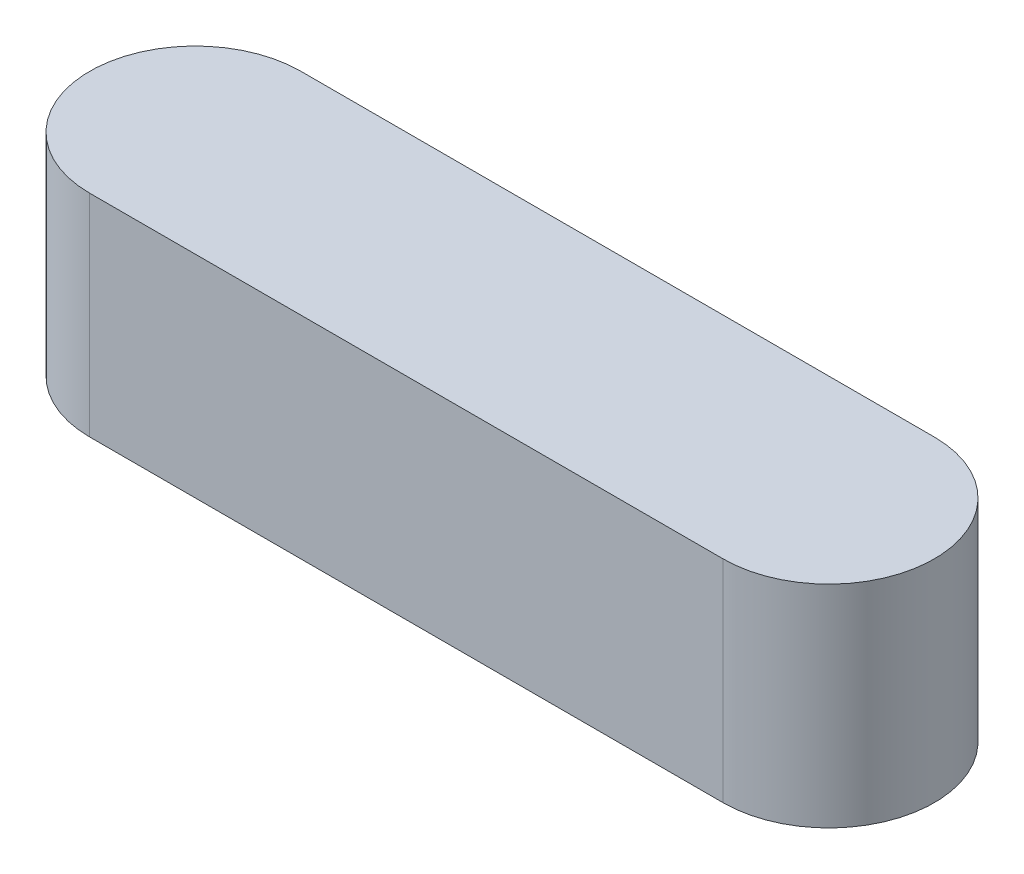
ISO-10303-21;
HEADER;
FILE_DESCRIPTION(('STEP AP214'),'2;1');
FILE_NAME('part.step','',(''),(''),'','','');
FILE_SCHEMA(('AUTOMOTIVE_DESIGN { 1 0 10303 214 1 1 1 1 }'));
ENDSEC;
DATA;
#1=APPLICATION_CONTEXT('core data for automotive mechanical design processes');
#2=APPLICATION_PROTOCOL_DEFINITION('international standard','automotive_design',2000,#1);
#3=PRODUCT_CONTEXT('',#1,'mechanical');
#4=PRODUCT('Part','Part','',(#3));
#5=PRODUCT_RELATED_PRODUCT_CATEGORY('part','',(#4));
#6=PRODUCT_DEFINITION_FORMATION('','',#4);
#7=PRODUCT_DEFINITION_CONTEXT('part definition',#1,'design');
#8=PRODUCT_DEFINITION('design','',#6,#7);
#9=PRODUCT_DEFINITION_SHAPE('','',#8);
#10=(LENGTH_UNIT() NAMED_UNIT(*) SI_UNIT(.MILLI.,.METRE.));
#11=(NAMED_UNIT(*) PLANE_ANGLE_UNIT() SI_UNIT($,.RADIAN.));
#12=(NAMED_UNIT(*) SI_UNIT($,.STERADIAN.) SOLID_ANGLE_UNIT());
#13=UNCERTAINTY_MEASURE_WITH_UNIT(LENGTH_MEASURE(1.E-05),#10,'distance_accuracy_value','');
#14=(GEOMETRIC_REPRESENTATION_CONTEXT(3) GLOBAL_UNCERTAINTY_ASSIGNED_CONTEXT((#13)) GLOBAL_UNIT_ASSIGNED_CONTEXT((#10,
#11,#12)) REPRESENTATION_CONTEXT('',''));
#15=CARTESIAN_POINT('',(0.,0.,0.));
#16=DIRECTION('',(0.,0.,1.));
#17=DIRECTION('',(1.,0.,0.));
#18=AXIS2_PLACEMENT_3D('',#15,#16,#17);
#19=CARTESIAN_POINT('',(1.5875,3.175,1.5875));
#20=DIRECTION('',(0.,-1.,0.));
#21=DIRECTION('',(0.,0.,-1.));
#22=AXIS2_PLACEMENT_3D('',#19,#20,#21);
#23=CYLINDRICAL_SURFACE('',#22,1.5875);
#24=DIRECTION('',(0.,-1.,0.));
#25=VECTOR('',#24,1.);
#26=CARTESIAN_POINT('',(1.5875,0.,3.175));
#27=LINE('',#26,#25);
#28=CARTESIAN_POINT('',(1.5875,3.175,3.175));
#29=VERTEX_POINT('',#28);
#30=CARTESIAN_POINT('',(1.5875,0.,3.175));
#31=VERTEX_POINT('',#30);
#32=EDGE_CURVE('E87',#29,#31,#27,.T.);
#33=ORIENTED_EDGE('',*,*,#32,.F.);
#34=CARTESIAN_POINT('',(1.5875,3.175,1.5875));
#35=DIRECTION('',(0.,-1.,0.));
#36=DIRECTION('',(0.,0.,-1.));
#37=AXIS2_PLACEMENT_3D('',#34,#35,#36);
#38=CIRCLE('',#37,1.5875);
#39=CARTESIAN_POINT('',(1.5875,3.175,0.));
#40=VERTEX_POINT('',#39);
#41=EDGE_CURVE('E50',#40,#29,#38,.F.);
#42=ORIENTED_EDGE('',*,*,#41,.F.);
#43=DIRECTION('',(0.,1.,0.));
#44=VECTOR('',#43,1.);
#45=CARTESIAN_POINT('',(1.5875,3.175,0.));
#46=LINE('',#45,#44);
#47=CARTESIAN_POINT('',(1.5875,0.,0.));
#48=VERTEX_POINT('',#47);
#49=EDGE_CURVE('E118',#48,#40,#46,.T.);
#50=ORIENTED_EDGE('',*,*,#49,.F.);
#51=CARTESIAN_POINT('',(1.5875,0.,1.5875));
#52=DIRECTION('',(0.,1.,0.));
#53=DIRECTION('',(0.,0.,1.));
#54=AXIS2_PLACEMENT_3D('',#51,#52,#53);
#55=CIRCLE('',#54,1.5875);
#56=EDGE_CURVE('E11',#31,#48,#55,.F.);
#57=ORIENTED_EDGE('',*,*,#56,.F.);
#58=EDGE_LOOP('',(#33,#42,#50,#57));
#59=FACE_BOUND('',#58,.T.);
#60=ADVANCED_FACE('F41',(#59),#23,.T.);
#61=CARTESIAN_POINT('',(11.1125,0.,1.5875));
#62=DIRECTION('',(0.,1.,0.));
#63=DIRECTION('',(0.,0.,1.));
#64=AXIS2_PLACEMENT_3D('',#61,#62,#63);
#65=CYLINDRICAL_SURFACE('',#64,1.5875);
#66=DIRECTION('',(0.,1.,0.));
#67=VECTOR('',#66,1.);
#68=CARTESIAN_POINT('',(11.1125,0.,3.175));
#69=LINE('',#68,#67);
#70=CARTESIAN_POINT('',(11.1125,0.,3.175));
#71=VERTEX_POINT('',#70);
#72=CARTESIAN_POINT('',(11.1125,3.175,3.175));
#73=VERTEX_POINT('',#72);
#74=EDGE_CURVE('E85',#71,#73,#69,.T.);
#75=ORIENTED_EDGE('',*,*,#74,.F.);
#76=CARTESIAN_POINT('',(11.1125,0.,1.5875));
#77=DIRECTION('',(0.,1.,0.));
#78=DIRECTION('',(0.,0.,1.));
#79=AXIS2_PLACEMENT_3D('',#76,#77,#78);
#80=CIRCLE('',#79,1.5875);
#81=CARTESIAN_POINT('',(11.1125,0.,0.));
#82=VERTEX_POINT('',#81);
#83=EDGE_CURVE('E93',#82,#71,#80,.F.);
#84=ORIENTED_EDGE('',*,*,#83,.F.);
#85=DIRECTION('',(0.,-1.,0.));
#86=VECTOR('',#85,1.);
#87=CARTESIAN_POINT('',(11.1125,0.,0.));
#88=LINE('',#87,#86);
#89=CARTESIAN_POINT('',(11.1125,3.175,0.));
#90=VERTEX_POINT('',#89);
#91=EDGE_CURVE('E102',#90,#82,#88,.T.);
#92=ORIENTED_EDGE('',*,*,#91,.F.);
#93=CARTESIAN_POINT('',(11.1125,3.175,1.5875));
#94=DIRECTION('',(0.,-1.,0.));
#95=DIRECTION('',(0.,0.,-1.));
#96=AXIS2_PLACEMENT_3D('',#93,#94,#95);
#97=CIRCLE('',#96,1.5875);
#98=EDGE_CURVE('E101',#73,#90,#97,.F.);
#99=ORIENTED_EDGE('',*,*,#98,.F.);
#100=EDGE_LOOP('',(#75,#84,#92,#99));
#101=FACE_BOUND('',#100,.T.);
#102=ADVANCED_FACE('F104',(#101),#65,.T.);
#103=CARTESIAN_POINT('',(0.,0.,3.175));
#104=DIRECTION('',(0.,1.,0.));
#105=DIRECTION('',(0.,0.,1.));
#106=AXIS2_PLACEMENT_3D('',#103,#104,#105);
#107=PLANE('',#106);
#108=DIRECTION('',(1.,0.,0.));
#109=VECTOR('',#108,1.);
#110=CARTESIAN_POINT('',(0.,0.,3.175));
#111=LINE('',#110,#109);
#112=EDGE_CURVE('E80',#31,#71,#111,.T.);
#113=ORIENTED_EDGE('',*,*,#112,.F.);
#114=ORIENTED_EDGE('',*,*,#56,.T.);
#115=DIRECTION('',(1.,0.,0.));
#116=VECTOR('',#115,1.);
#117=CARTESIAN_POINT('',(0.,0.,0.));
#118=LINE('',#117,#116);
#119=EDGE_CURVE('E96',#48,#82,#118,.T.);
#120=ORIENTED_EDGE('',*,*,#119,.T.);
#121=ORIENTED_EDGE('',*,*,#83,.T.);
#122=EDGE_LOOP('',(#113,#114,#120,#121));
#123=FACE_BOUND('',#122,.T.);
#124=ADVANCED_FACE('F94',(#123),#107,.F.);
#125=CARTESIAN_POINT('',(0.,3.175,3.175));
#126=DIRECTION('',(0.,-1.,0.));
#127=DIRECTION('',(0.,0.,-1.));
#128=AXIS2_PLACEMENT_3D('',#125,#126,#127);
#129=PLANE('',#128);
#130=DIRECTION('',(-1.,0.,0.));
#131=VECTOR('',#130,1.);
#132=CARTESIAN_POINT('',(0.,3.175,0.));
#133=LINE('',#132,#131);
#134=EDGE_CURVE('E90',#90,#40,#133,.T.);
#135=ORIENTED_EDGE('',*,*,#134,.T.);
#136=ORIENTED_EDGE('',*,*,#41,.T.);
#137=DIRECTION('',(-1.,0.,0.));
#138=VECTOR('',#137,1.);
#139=CARTESIAN_POINT('',(0.,3.175,3.175));
#140=LINE('',#139,#138);
#141=EDGE_CURVE('E89',#73,#29,#140,.T.);
#142=ORIENTED_EDGE('',*,*,#141,.F.);
#143=ORIENTED_EDGE('',*,*,#98,.T.);
#144=EDGE_LOOP('',(#135,#136,#142,#143));
#145=FACE_BOUND('',#144,.T.);
#146=ADVANCED_FACE('F123',(#145),#129,.F.);
#147=CARTESIAN_POINT('',(0.,0.,3.175));
#148=DIRECTION('',(0.,0.,-1.));
#149=DIRECTION('',(-1.,0.,0.));
#150=AXIS2_PLACEMENT_3D('',#147,#148,#149);
#151=PLANE('',#150);
#152=ORIENTED_EDGE('',*,*,#141,.T.);
#153=ORIENTED_EDGE('',*,*,#32,.T.);
#154=ORIENTED_EDGE('',*,*,#112,.T.);
#155=ORIENTED_EDGE('',*,*,#74,.T.);
#156=EDGE_LOOP('',(#152,#153,#154,#155));
#157=FACE_BOUND('',#156,.T.);
#158=ADVANCED_FACE('F83',(#157),#151,.F.);
#159=CARTESIAN_POINT('',(0.,0.,0.));
#160=DIRECTION('',(0.,0.,-1.));
#161=DIRECTION('',(-1.,0.,0.));
#162=AXIS2_PLACEMENT_3D('',#159,#160,#161);
#163=PLANE('',#162);
#164=ORIENTED_EDGE('',*,*,#119,.F.);
#165=ORIENTED_EDGE('',*,*,#49,.T.);
#166=ORIENTED_EDGE('',*,*,#134,.F.);
#167=ORIENTED_EDGE('',*,*,#91,.T.);
#168=EDGE_LOOP('',(#164,#165,#166,#167));
#169=FACE_BOUND('',#168,.T.);
#170=ADVANCED_FACE('F126',(#169),#163,.T.);
#171=CLOSED_SHELL('',(#60,#102,#124,#146,#158,#170));
#172=MANIFOLD_SOLID_BREP('B2',#171);
#173=ADVANCED_BREP_SHAPE_REPRESENTATION('',(#18,#172),#14);
#174=SHAPE_DEFINITION_REPRESENTATION(#9,#173);
ENDSEC;
END-ISO-10303-21;
